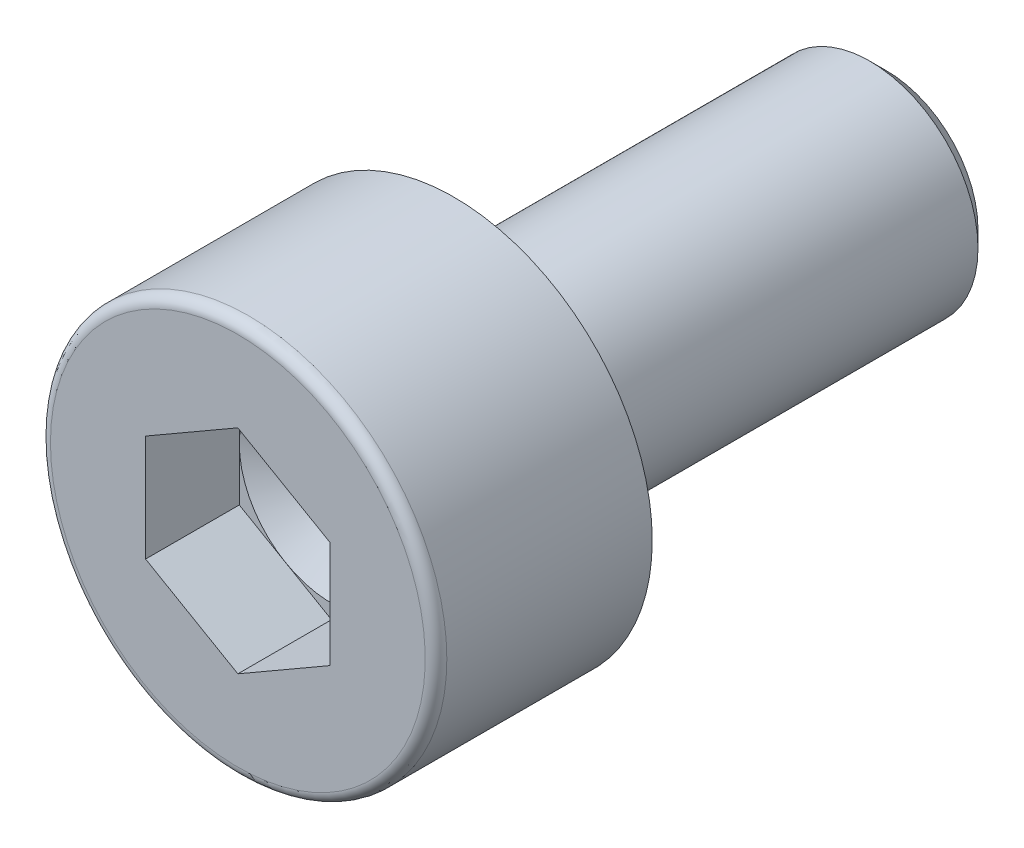
ISO-10303-21;
HEADER;
FILE_DESCRIPTION(('STEP AP214'),'2;1');
FILE_NAME('part.step','',(''),(''),'','','');
FILE_SCHEMA(('AUTOMOTIVE_DESIGN { 1 0 10303 214 1 1 1 1 }'));
ENDSEC;
DATA;
#1=APPLICATION_CONTEXT('core data for automotive mechanical design processes');
#2=APPLICATION_PROTOCOL_DEFINITION('international standard','automotive_design',2000,#1);
#3=PRODUCT_CONTEXT('',#1,'mechanical');
#4=PRODUCT('Part','Part','',(#3));
#5=PRODUCT_RELATED_PRODUCT_CATEGORY('part','',(#4));
#6=PRODUCT_DEFINITION_FORMATION('','',#4);
#7=PRODUCT_DEFINITION_CONTEXT('part definition',#1,'design');
#8=PRODUCT_DEFINITION('design','',#6,#7);
#9=PRODUCT_DEFINITION_SHAPE('','',#8);
#10=(LENGTH_UNIT() NAMED_UNIT(*) SI_UNIT(.MILLI.,.METRE.));
#11=(NAMED_UNIT(*) PLANE_ANGLE_UNIT() SI_UNIT($,.RADIAN.));
#12=(NAMED_UNIT(*) SI_UNIT($,.STERADIAN.) SOLID_ANGLE_UNIT());
#13=UNCERTAINTY_MEASURE_WITH_UNIT(LENGTH_MEASURE(1.E-05),#10,'distance_accuracy_value','');
#14=(GEOMETRIC_REPRESENTATION_CONTEXT(3) GLOBAL_UNCERTAINTY_ASSIGNED_CONTEXT((#13)) GLOBAL_UNIT_ASSIGNED_CONTEXT((#10,
#11,#12)) REPRESENTATION_CONTEXT('',''));
#15=CARTESIAN_POINT('',(0.,0.,0.));
#16=DIRECTION('',(0.,0.,1.));
#17=DIRECTION('',(1.,0.,0.));
#18=AXIS2_PLACEMENT_3D('',#15,#16,#17);
#19=CARTESIAN_POINT('',(0.,1.47801668912544,1.7));
#20=DIRECTION('',(0.,0.,1.));
#21=DIRECTION('',(1.,0.,0.));
#22=AXIS2_PLACEMENT_3D('',#19,#20,#21);
#23=PLANE('',#22);
#24=DIRECTION('',(0.,-1.,0.));
#25=VECTOR('',#24,1.);
#26=CARTESIAN_POINT('',(-1.28,0.739008344562722,1.7));
#27=LINE('',#26,#25);
#28=CARTESIAN_POINT('',(-1.28,0.739008344562722,1.7));
#29=VERTEX_POINT('',#28);
#30=CARTESIAN_POINT('',(-1.28,0.,1.7));
#31=VERTEX_POINT('',#30);
#32=EDGE_CURVE('E145',#29,#31,#27,.T.);
#33=ORIENTED_EDGE('',*,*,#32,.T.);
#34=CARTESIAN_POINT('',(0.,0.,1.7));
#35=DIRECTION('',(0.,0.,-1.));
#36=DIRECTION('',(-1.,0.,0.));
#37=AXIS2_PLACEMENT_3D('',#34,#35,#36);
#38=CIRCLE('',#37,1.28);
#39=CARTESIAN_POINT('',(-0.64,1.10851251684408,1.7));
#40=VERTEX_POINT('',#39);
#41=EDGE_CURVE('E28',#31,#40,#38,.T.);
#42=ORIENTED_EDGE('',*,*,#41,.T.);
#43=DIRECTION('',(-0.866025403784439,-0.5,0.));
#44=VECTOR('',#43,1.);
#45=CARTESIAN_POINT('',(0.,1.47801668912544,1.7));
#46=LINE('',#45,#44);
#47=EDGE_CURVE('E209',#40,#29,#46,.T.);
#48=ORIENTED_EDGE('',*,*,#47,.T.);
#49=EDGE_LOOP('',(#33,#42,#48));
#50=FACE_BOUND('',#49,.T.);
#51=ADVANCED_FACE('F17',(#50),#23,.T.);
#52=CARTESIAN_POINT('',(0.,1.47801668912544,1.7));
#53=VERTEX_POINT('',#52);
#54=EDGE_CURVE('E214',#53,#40,#46,.T.);
#55=ORIENTED_EDGE('',*,*,#54,.T.);
#56=CARTESIAN_POINT('',(0.64,1.10851251684408,1.7));
#57=VERTEX_POINT('',#56);
#58=EDGE_CURVE('E11',#40,#57,#38,.T.);
#59=ORIENTED_EDGE('',*,*,#58,.T.);
#60=DIRECTION('',(-0.866025403784439,0.5,0.));
#61=VECTOR('',#60,1.);
#62=CARTESIAN_POINT('',(1.28,0.739008344562722,1.7));
#63=LINE('',#62,#61);
#64=EDGE_CURVE('E171',#57,#53,#63,.T.);
#65=ORIENTED_EDGE('',*,*,#64,.T.);
#66=EDGE_LOOP('',(#55,#59,#65));
#67=FACE_BOUND('',#66,.T.);
#68=ADVANCED_FACE('F106',(#67),#23,.T.);
#69=CARTESIAN_POINT('',(1.28,0.739008344562722,1.7));
#70=VERTEX_POINT('',#69);
#71=EDGE_CURVE('E215',#70,#57,#63,.T.);
#72=ORIENTED_EDGE('',*,*,#71,.T.);
#73=CARTESIAN_POINT('',(1.28,0.,1.7));
#74=VERTEX_POINT('',#73);
#75=EDGE_CURVE('E26',#57,#74,#38,.T.);
#76=ORIENTED_EDGE('',*,*,#75,.T.);
#77=DIRECTION('',(0.,1.,0.));
#78=VECTOR('',#77,1.);
#79=CARTESIAN_POINT('',(1.28,-0.739008344562722,1.7));
#80=LINE('',#79,#78);
#81=EDGE_CURVE('E150',#74,#70,#80,.T.);
#82=ORIENTED_EDGE('',*,*,#81,.T.);
#83=EDGE_LOOP('',(#72,#76,#82));
#84=FACE_BOUND('',#83,.T.);
#85=ADVANCED_FACE('F113',(#84),#23,.T.);
#86=CARTESIAN_POINT('',(1.28,-0.739008344562722,1.7));
#87=VERTEX_POINT('',#86);
#88=EDGE_CURVE('E151',#87,#74,#80,.T.);
#89=ORIENTED_EDGE('',*,*,#88,.T.);
#90=CARTESIAN_POINT('',(0.64,-1.10851251684408,1.7));
#91=VERTEX_POINT('',#90);
#92=EDGE_CURVE('E206',#74,#91,#38,.T.);
#93=ORIENTED_EDGE('',*,*,#92,.T.);
#94=DIRECTION('',(0.866025403784439,0.5,0.));
#95=VECTOR('',#94,1.);
#96=CARTESIAN_POINT('',(0.,-1.47801668912544,1.7));
#97=LINE('',#96,#95);
#98=EDGE_CURVE('E140',#91,#87,#97,.T.);
#99=ORIENTED_EDGE('',*,*,#98,.T.);
#100=EDGE_LOOP('',(#89,#93,#99));
#101=FACE_BOUND('',#100,.T.);
#102=ADVANCED_FACE('F129',(#101),#23,.T.);
#103=CARTESIAN_POINT('',(0.,-1.47801668912544,1.7));
#104=VERTEX_POINT('',#103);
#105=EDGE_CURVE('E143',#104,#91,#97,.T.);
#106=ORIENTED_EDGE('',*,*,#105,.T.);
#107=CARTESIAN_POINT('',(-0.64,-1.10851251684408,1.7));
#108=VERTEX_POINT('',#107);
#109=EDGE_CURVE('E204',#91,#108,#38,.T.);
#110=ORIENTED_EDGE('',*,*,#109,.T.);
#111=DIRECTION('',(0.866025403784439,-0.5,0.));
#112=VECTOR('',#111,1.);
#113=CARTESIAN_POINT('',(-1.28,-0.739008344562721,1.7));
#114=LINE('',#113,#112);
#115=EDGE_CURVE('E141',#108,#104,#114,.T.);
#116=ORIENTED_EDGE('',*,*,#115,.T.);
#117=EDGE_LOOP('',(#106,#110,#116));
#118=FACE_BOUND('',#117,.T.);
#119=ADVANCED_FACE('F119',(#118),#23,.T.);
#120=CARTESIAN_POINT('',(-1.28,-0.739008344562721,1.7));
#121=VERTEX_POINT('',#120);
#122=EDGE_CURVE('E133',#121,#108,#114,.T.);
#123=ORIENTED_EDGE('',*,*,#122,.T.);
#124=EDGE_CURVE('E134',#108,#31,#38,.T.);
#125=ORIENTED_EDGE('',*,*,#124,.T.);
#126=EDGE_CURVE('E136',#31,#121,#27,.T.);
#127=ORIENTED_EDGE('',*,*,#126,.T.);
#128=EDGE_LOOP('',(#123,#125,#127));
#129=FACE_BOUND('',#128,.T.);
#130=ADVANCED_FACE('F108',(#129),#23,.T.);
#131=CARTESIAN_POINT('',(0.,0.,3.));
#132=DIRECTION('',(0.,0.,-1.));
#133=DIRECTION('',(-1.,0.,0.));
#134=AXIS2_PLACEMENT_3D('',#131,#132,#133);
#135=PLANE('',#134);
#136=DIRECTION('',(-0.866025403784439,-0.5,0.));
#137=VECTOR('',#136,1.);
#138=CARTESIAN_POINT('',(0.,1.47801668912544,3.));
#139=LINE('',#138,#137);
#140=CARTESIAN_POINT('',(0.,1.47801668912544,3.));
#141=VERTEX_POINT('',#140);
#142=CARTESIAN_POINT('',(-1.28,0.739008344562722,3.));
#143=VERTEX_POINT('',#142);
#144=EDGE_CURVE('E156',#141,#143,#139,.T.);
#145=ORIENTED_EDGE('',*,*,#144,.F.);
#146=DIRECTION('',(-0.866025403784439,0.5,0.));
#147=VECTOR('',#146,1.);
#148=CARTESIAN_POINT('',(1.28,0.739008344562722,3.));
#149=LINE('',#148,#147);
#150=CARTESIAN_POINT('',(1.28,0.739008344562722,3.));
#151=VERTEX_POINT('',#150);
#152=EDGE_CURVE('E42',#151,#141,#149,.T.);
#153=ORIENTED_EDGE('',*,*,#152,.F.);
#154=DIRECTION('',(0.,1.,0.));
#155=VECTOR('',#154,1.);
#156=CARTESIAN_POINT('',(1.28,-0.739008344562722,3.));
#157=LINE('',#156,#155);
#158=CARTESIAN_POINT('',(1.28,-0.739008344562722,3.));
#159=VERTEX_POINT('',#158);
#160=EDGE_CURVE('E168',#159,#151,#157,.T.);
#161=ORIENTED_EDGE('',*,*,#160,.F.);
#162=DIRECTION('',(0.866025403784439,0.5,0.));
#163=VECTOR('',#162,1.);
#164=CARTESIAN_POINT('',(0.,-1.47801668912544,3.));
#165=LINE('',#164,#163);
#166=CARTESIAN_POINT('',(0.,-1.47801668912544,3.));
#167=VERTEX_POINT('',#166);
#168=EDGE_CURVE('E165',#167,#159,#165,.T.);
#169=ORIENTED_EDGE('',*,*,#168,.F.);
#170=DIRECTION('',(0.866025403784439,-0.5,0.));
#171=VECTOR('',#170,1.);
#172=CARTESIAN_POINT('',(-1.28,-0.739008344562721,3.));
#173=LINE('',#172,#171);
#174=CARTESIAN_POINT('',(-1.28,-0.739008344562721,3.));
#175=VERTEX_POINT('',#174);
#176=EDGE_CURVE('E162',#175,#167,#173,.T.);
#177=ORIENTED_EDGE('',*,*,#176,.F.);
#178=DIRECTION('',(0.,-1.,0.));
#179=VECTOR('',#178,1.);
#180=CARTESIAN_POINT('',(-1.28,0.739008344562722,3.));
#181=LINE('',#180,#179);
#182=EDGE_CURVE('E159',#143,#175,#181,.T.);
#183=ORIENTED_EDGE('',*,*,#182,.F.);
#184=EDGE_LOOP('',(#145,#153,#161,#169,#177,#183));
#185=FACE_BOUND('',#184,.T.);
#186=CARTESIAN_POINT('',(0.,0.,3.));
#187=DIRECTION('',(0.,0.,-1.));
#188=DIRECTION('',(-1.,0.,0.));
#189=AXIS2_PLACEMENT_3D('',#186,#187,#188);
#190=CIRCLE('',#189,2.6);
#191=CARTESIAN_POINT('',(-2.6,0.,3.));
#192=VERTEX_POINT('',#191);
#193=EDGE_CURVE('E192',#192,#192,#190,.F.);
#194=ORIENTED_EDGE('',*,*,#193,.T.);
#195=EDGE_LOOP('',(#194));
#196=FACE_BOUND('',#195,.T.);
#197=ADVANCED_FACE('F118',(#185,#196),#135,.F.);
#198=CARTESIAN_POINT('',(0.,0.,3.));
#199=DIRECTION('',(0.,0.,1.));
#200=DIRECTION('',(1.,0.,0.));
#201=AXIS2_PLACEMENT_3D('',#198,#199,#200);
#202=CYLINDRICAL_SURFACE('',#201,2.75);
#203=CARTESIAN_POINT('',(0.,0.,2.85));
#204=DIRECTION('',(0.,0.,-1.));
#205=DIRECTION('',(-1.,0.,0.));
#206=AXIS2_PLACEMENT_3D('',#203,#204,#205);
#207=CIRCLE('',#206,2.75);
#208=CARTESIAN_POINT('',(-2.75,0.,2.85));
#209=VERTEX_POINT('',#208);
#210=EDGE_CURVE('E195',#209,#209,#207,.T.);
#211=ORIENTED_EDGE('',*,*,#210,.T.);
#212=EDGE_LOOP('',(#211));
#213=FACE_BOUND('',#212,.T.);
#214=CARTESIAN_POINT('',(0.,0.,0.));
#215=DIRECTION('',(0.,0.,1.));
#216=DIRECTION('',(1.,0.,0.));
#217=AXIS2_PLACEMENT_3D('',#214,#215,#216);
#218=CIRCLE('',#217,2.75);
#219=CARTESIAN_POINT('',(2.75,0.,0.));
#220=VERTEX_POINT('',#219);
#221=EDGE_CURVE('E174',#220,#220,#218,.T.);
#222=ORIENTED_EDGE('',*,*,#221,.T.);
#223=EDGE_LOOP('',(#222));
#224=FACE_BOUND('',#223,.T.);
#225=ADVANCED_FACE('F126',(#213,#224),#202,.T.);
#226=CARTESIAN_POINT('',(0.,2.75,0.));
#227=DIRECTION('',(0.,0.,1.));
#228=DIRECTION('',(1.,0.,0.));
#229=AXIS2_PLACEMENT_3D('',#226,#227,#228);
#230=PLANE('',#229);
#231=CARTESIAN_POINT('',(0.,0.,0.));
#232=DIRECTION('',(0.,0.,1.));
#233=DIRECTION('',(1.,0.,0.));
#234=AXIS2_PLACEMENT_3D('',#231,#232,#233);
#235=CIRCLE('',#234,1.6);
#236=CARTESIAN_POINT('',(1.6,0.,0.));
#237=VERTEX_POINT('',#236);
#238=EDGE_CURVE('E197',#237,#237,#235,.T.);
#239=ORIENTED_EDGE('',*,*,#238,.T.);
#240=EDGE_LOOP('',(#239));
#241=FACE_BOUND('',#240,.T.);
#242=ORIENTED_EDGE('',*,*,#221,.F.);
#243=EDGE_LOOP('',(#242));
#244=FACE_BOUND('',#243,.T.);
#245=ADVANCED_FACE('F264',(#241,#244),#230,.F.);
#246=CARTESIAN_POINT('',(0.,0.,3.));
#247=DIRECTION('',(0.,0.,1.));
#248=DIRECTION('',(1.,0.,0.));
#249=AXIS2_PLACEMENT_3D('',#246,#247,#248);
#250=CYLINDRICAL_SURFACE('',#249,1.5);
#251=CARTESIAN_POINT('',(0.,0.,-0.1));
#252=DIRECTION('',(0.,0.,1.));
#253=DIRECTION('',(1.,0.,0.));
#254=AXIS2_PLACEMENT_3D('',#251,#252,#253);
#255=CIRCLE('',#254,1.5);
#256=CARTESIAN_POINT('',(1.5,0.,-0.1));
#257=VERTEX_POINT('',#256);
#258=EDGE_CURVE('E21',#257,#257,#255,.F.);
#259=ORIENTED_EDGE('',*,*,#258,.T.);
#260=EDGE_LOOP('',(#259));
#261=FACE_BOUND('',#260,.T.);
#262=CARTESIAN_POINT('',(0.,0.,-5.77));
#263=DIRECTION('',(0.,0.,1.));
#264=DIRECTION('',(1.,0.,0.));
#265=AXIS2_PLACEMENT_3D('',#262,#263,#264);
#266=CIRCLE('',#265,1.5);
#267=CARTESIAN_POINT('',(1.5,0.,-5.77));
#268=VERTEX_POINT('',#267);
#269=EDGE_CURVE('E186',#268,#268,#266,.T.);
#270=ORIENTED_EDGE('',*,*,#269,.T.);
#271=EDGE_LOOP('',(#270));
#272=FACE_BOUND('',#271,.T.);
#273=ADVANCED_FACE('F260',(#261,#272),#250,.T.);
#274=CARTESIAN_POINT('',(0.,1.5,-6.));
#275=DIRECTION('',(0.,0.,1.));
#276=DIRECTION('',(1.,0.,0.));
#277=AXIS2_PLACEMENT_3D('',#274,#275,#276);
#278=PLANE('',#277);
#279=CARTESIAN_POINT('',(0.,0.,-6.));
#280=DIRECTION('',(0.,0.,1.));
#281=DIRECTION('',(1.,0.,0.));
#282=AXIS2_PLACEMENT_3D('',#279,#280,#281);
#283=CIRCLE('',#282,1.27);
#284=CARTESIAN_POINT('',(1.27,0.,-6.));
#285=VERTEX_POINT('',#284);
#286=EDGE_CURVE('E189',#285,#285,#283,.F.);
#287=ORIENTED_EDGE('',*,*,#286,.T.);
#288=EDGE_LOOP('',(#287));
#289=FACE_BOUND('',#288,.T.);
#290=ADVANCED_FACE('F256',(#289),#278,.F.);
#291=CARTESIAN_POINT('',(0.,0.,-5.77));
#292=DIRECTION('',(0.,0.,1.));
#293=DIRECTION('',(1.,0.,0.));
#294=AXIS2_PLACEMENT_3D('',#291,#292,#293);
#295=CONICAL_SURFACE('',#294,1.5,0.785398163397451);
#296=ORIENTED_EDGE('',*,*,#286,.F.);
#297=EDGE_LOOP('',(#296));
#298=FACE_BOUND('',#297,.T.);
#299=ORIENTED_EDGE('',*,*,#269,.F.);
#300=EDGE_LOOP('',(#299));
#301=FACE_BOUND('',#300,.T.);
#302=ADVANCED_FACE('F259',(#298,#301),#295,.T.);
#303=CARTESIAN_POINT('',(0.,0.,2.85));
#304=DIRECTION('',(0.,0.,-1.));
#305=DIRECTION('',(-1.,0.,0.));
#306=AXIS2_PLACEMENT_3D('',#303,#304,#305);
#307=TOROIDAL_SURFACE('',#306,2.6,0.15);
#308=ORIENTED_EDGE('',*,*,#210,.F.);
#309=EDGE_LOOP('',(#308));
#310=FACE_BOUND('',#309,.T.);
#311=ORIENTED_EDGE('',*,*,#193,.F.);
#312=EDGE_LOOP('',(#311));
#313=FACE_BOUND('',#312,.T.);
#314=ADVANCED_FACE('F271',(#310,#313),#307,.T.);
#315=CARTESIAN_POINT('',(0.,0.,-0.1));
#316=DIRECTION('',(0.,0.,1.));
#317=DIRECTION('',(1.,0.,0.));
#318=AXIS2_PLACEMENT_3D('',#315,#316,#317);
#319=TOROIDAL_SURFACE('',#318,1.6,0.1);
#320=ORIENTED_EDGE('',*,*,#258,.F.);
#321=EDGE_LOOP('',(#320));
#322=FACE_BOUND('',#321,.T.);
#323=ORIENTED_EDGE('',*,*,#238,.F.);
#324=EDGE_LOOP('',(#323));
#325=FACE_BOUND('',#324,.T.);
#326=ADVANCED_FACE('F19',(#322,#325),#319,.F.);
#327=CARTESIAN_POINT('',(1.28,0.739008344562722,1.7));
#328=DIRECTION('',(0.5,0.866025403784439,0.));
#329=DIRECTION('',(-0.866025403784439,0.5,0.));
#330=AXIS2_PLACEMENT_3D('',#327,#328,#329);
#331=PLANE('',#330);
#332=ORIENTED_EDGE('',*,*,#152,.T.);
#333=DIRECTION('',(0.,0.,1.));
#334=VECTOR('',#333,1.);
#335=CARTESIAN_POINT('',(0.,1.47801668912544,1.7));
#336=LINE('',#335,#334);
#337=EDGE_CURVE('E154',#53,#141,#336,.T.);
#338=ORIENTED_EDGE('',*,*,#337,.F.);
#339=ORIENTED_EDGE('',*,*,#64,.F.);
#340=ORIENTED_EDGE('',*,*,#71,.F.);
#341=DIRECTION('',(0.,0.,1.));
#342=VECTOR('',#341,1.);
#343=CARTESIAN_POINT('',(1.28,0.739008344562722,1.7));
#344=LINE('',#343,#342);
#345=EDGE_CURVE('E172',#70,#151,#344,.T.);
#346=ORIENTED_EDGE('',*,*,#345,.T.);
#347=EDGE_LOOP('',(#332,#338,#339,#340,#346));
#348=FACE_BOUND('',#347,.T.);
#349=ADVANCED_FACE('F223',(#348),#331,.F.);
#350=CARTESIAN_POINT('',(1.28,-0.739008344562722,1.7));
#351=DIRECTION('',(1.,0.,0.));
#352=DIRECTION('',(0.,1.,0.));
#353=AXIS2_PLACEMENT_3D('',#350,#351,#352);
#354=PLANE('',#353);
#355=ORIENTED_EDGE('',*,*,#160,.T.);
#356=ORIENTED_EDGE('',*,*,#345,.F.);
#357=ORIENTED_EDGE('',*,*,#81,.F.);
#358=ORIENTED_EDGE('',*,*,#88,.F.);
#359=DIRECTION('',(0.,0.,1.));
#360=VECTOR('',#359,1.);
#361=CARTESIAN_POINT('',(1.28,-0.739008344562722,1.7));
#362=LINE('',#361,#360);
#363=EDGE_CURVE('E175',#87,#159,#362,.T.);
#364=ORIENTED_EDGE('',*,*,#363,.T.);
#365=EDGE_LOOP('',(#355,#356,#357,#358,#364));
#366=FACE_BOUND('',#365,.T.);
#367=ADVANCED_FACE('F242',(#366),#354,.F.);
#368=CARTESIAN_POINT('',(0.,-1.47801668912544,1.7));
#369=DIRECTION('',(0.5,-0.866025403784439,0.));
#370=DIRECTION('',(0.866025403784439,0.5,0.));
#371=AXIS2_PLACEMENT_3D('',#368,#369,#370);
#372=PLANE('',#371);
#373=ORIENTED_EDGE('',*,*,#168,.T.);
#374=ORIENTED_EDGE('',*,*,#363,.F.);
#375=ORIENTED_EDGE('',*,*,#98,.F.);
#376=ORIENTED_EDGE('',*,*,#105,.F.);
#377=DIRECTION('',(0.,0.,1.));
#378=VECTOR('',#377,1.);
#379=CARTESIAN_POINT('',(0.,-1.47801668912544,1.7));
#380=LINE('',#379,#378);
#381=EDGE_CURVE('E177',#104,#167,#380,.T.);
#382=ORIENTED_EDGE('',*,*,#381,.T.);
#383=EDGE_LOOP('',(#373,#374,#375,#376,#382));
#384=FACE_BOUND('',#383,.T.);
#385=ADVANCED_FACE('F236',(#384),#372,.F.);
#386=CARTESIAN_POINT('',(-1.28,-0.739008344562721,1.7));
#387=DIRECTION('',(-0.5,-0.866025403784439,0.));
#388=DIRECTION('',(0.866025403784439,-0.5,0.));
#389=AXIS2_PLACEMENT_3D('',#386,#387,#388);
#390=PLANE('',#389);
#391=ORIENTED_EDGE('',*,*,#176,.T.);
#392=ORIENTED_EDGE('',*,*,#381,.F.);
#393=ORIENTED_EDGE('',*,*,#115,.F.);
#394=ORIENTED_EDGE('',*,*,#122,.F.);
#395=DIRECTION('',(0.,0.,1.));
#396=VECTOR('',#395,1.);
#397=CARTESIAN_POINT('',(-1.28,-0.739008344562721,1.7));
#398=LINE('',#397,#396);
#399=EDGE_CURVE('E179',#121,#175,#398,.T.);
#400=ORIENTED_EDGE('',*,*,#399,.T.);
#401=EDGE_LOOP('',(#391,#392,#393,#394,#400));
#402=FACE_BOUND('',#401,.T.);
#403=ADVANCED_FACE('F231',(#402),#390,.F.);
#404=CARTESIAN_POINT('',(-1.28,0.739008344562722,1.7));
#405=DIRECTION('',(-1.,0.,0.));
#406=DIRECTION('',(0.,0.,1.));
#407=AXIS2_PLACEMENT_3D('',#404,#405,#406);
#408=PLANE('',#407);
#409=ORIENTED_EDGE('',*,*,#182,.T.);
#410=ORIENTED_EDGE('',*,*,#399,.F.);
#411=ORIENTED_EDGE('',*,*,#126,.F.);
#412=ORIENTED_EDGE('',*,*,#32,.F.);
#413=DIRECTION('',(0.,0.,1.));
#414=VECTOR('',#413,1.);
#415=CARTESIAN_POINT('',(-1.28,0.739008344562722,1.7));
#416=LINE('',#415,#414);
#417=EDGE_CURVE('E181',#29,#143,#416,.T.);
#418=ORIENTED_EDGE('',*,*,#417,.T.);
#419=EDGE_LOOP('',(#409,#410,#411,#412,#418));
#420=FACE_BOUND('',#419,.T.);
#421=ADVANCED_FACE('F101',(#420),#408,.F.);
#422=CARTESIAN_POINT('',(0.,1.47801668912544,1.7));
#423=DIRECTION('',(-0.5,0.866025403784439,0.));
#424=DIRECTION('',(-0.866025403784439,-0.5,0.));
#425=AXIS2_PLACEMENT_3D('',#422,#423,#424);
#426=PLANE('',#425);
#427=ORIENTED_EDGE('',*,*,#144,.T.);
#428=ORIENTED_EDGE('',*,*,#417,.F.);
#429=ORIENTED_EDGE('',*,*,#47,.F.);
#430=ORIENTED_EDGE('',*,*,#54,.F.);
#431=ORIENTED_EDGE('',*,*,#337,.T.);
#432=EDGE_LOOP('',(#427,#428,#429,#430,#431));
#433=FACE_BOUND('',#432,.T.);
#434=ADVANCED_FACE('F94',(#433),#426,.F.);
#435=CARTESIAN_POINT('',(0.,0.,0.960991655437276));
#436=DIRECTION('',(0.,0.,1.));
#437=DIRECTION('',(1.,0.,0.));
#438=AXIS2_PLACEMENT_3D('',#435,#436,#437);
#439=CONICAL_SURFACE('',#438,0.,1.0471975511966);
#440=ORIENTED_EDGE('',*,*,#41,.F.);
#441=ORIENTED_EDGE('',*,*,#124,.F.);
#442=ORIENTED_EDGE('',*,*,#109,.F.);
#443=ORIENTED_EDGE('',*,*,#92,.F.);
#444=ORIENTED_EDGE('',*,*,#75,.F.);
#445=ORIENTED_EDGE('',*,*,#58,.F.);
#446=EDGE_LOOP('',(#440,#441,#442,#443,#444,#445));
#447=FACE_BOUND('',#446,.T.);
#448=CARTESIAN_POINT('',(0.,0.,0.960991655437276));
#449=VERTEX_POINT('',#448);
#450=VERTEX_LOOP('',#449);
#451=FACE_BOUND('',#450,.T.);
#452=ADVANCED_FACE('F92',(#447,#451),#439,.F.);
#453=CLOSED_SHELL('',(#51,#68,#85,#102,#119,#130,#197,#225,#245,#273,#290,#302,#314,#326,#349,
#367,#385,#403,#421,#434,#452));
#454=MANIFOLD_SOLID_BREP('B1',#453);
#455=ADVANCED_BREP_SHAPE_REPRESENTATION('',(#18,#454),#14);
#456=SHAPE_DEFINITION_REPRESENTATION(#9,#455);
ENDSEC;
END-ISO-10303-21;
